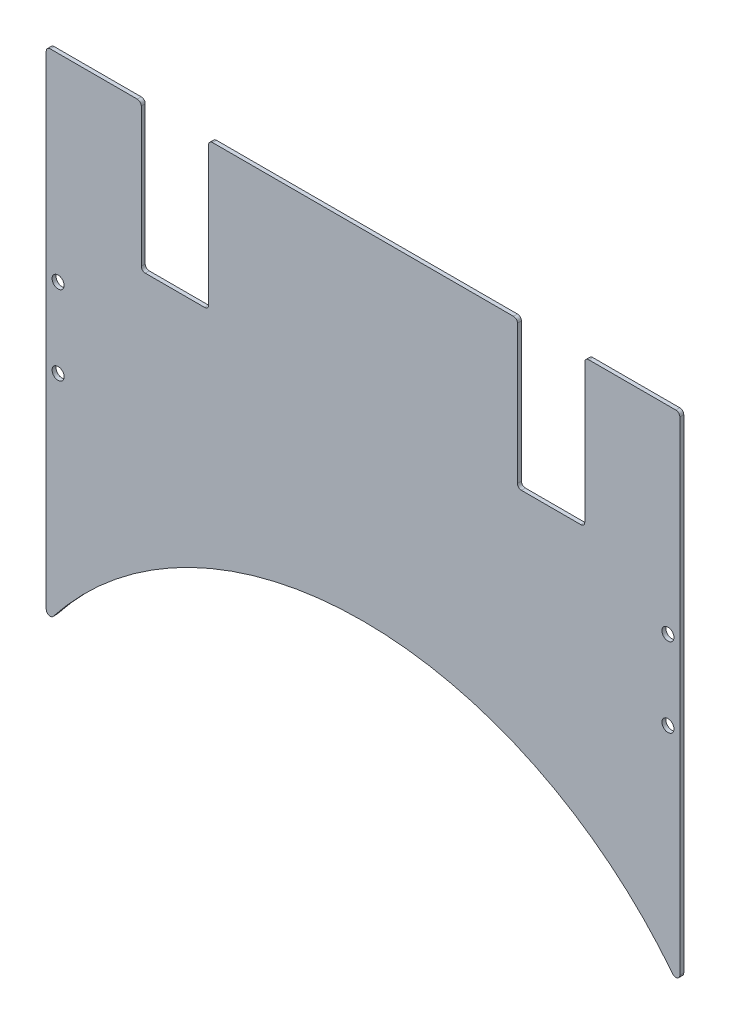
ISO-10303-21;
HEADER;
FILE_DESCRIPTION(('STEP AP214'),'2;1');
FILE_NAME('part.step','',(''),(''),'','','');
FILE_SCHEMA(('AUTOMOTIVE_DESIGN { 1 0 10303 214 1 1 1 1 }'));
ENDSEC;
DATA;
#1=APPLICATION_CONTEXT('core data for automotive mechanical design processes');
#2=APPLICATION_PROTOCOL_DEFINITION('international standard','automotive_design',2000,#1);
#3=PRODUCT_CONTEXT('',#1,'mechanical');
#4=PRODUCT('Part','Part','',(#3));
#5=PRODUCT_RELATED_PRODUCT_CATEGORY('part','',(#4));
#6=PRODUCT_DEFINITION_FORMATION('','',#4);
#7=PRODUCT_DEFINITION_CONTEXT('part definition',#1,'design');
#8=PRODUCT_DEFINITION('design','',#6,#7);
#9=PRODUCT_DEFINITION_SHAPE('','',#8);
#10=(LENGTH_UNIT() NAMED_UNIT(*) SI_UNIT(.MILLI.,.METRE.));
#11=(NAMED_UNIT(*) PLANE_ANGLE_UNIT() SI_UNIT($,.RADIAN.));
#12=(NAMED_UNIT(*) SI_UNIT($,.STERADIAN.) SOLID_ANGLE_UNIT());
#13=UNCERTAINTY_MEASURE_WITH_UNIT(LENGTH_MEASURE(1.E-05),#10,'distance_accuracy_value','');
#14=(GEOMETRIC_REPRESENTATION_CONTEXT(3) GLOBAL_UNCERTAINTY_ASSIGNED_CONTEXT((#13)) GLOBAL_UNIT_ASSIGNED_CONTEXT((#10,
#11,#12)) REPRESENTATION_CONTEXT('',''));
#15=CARTESIAN_POINT('',(0.,0.,0.));
#16=DIRECTION('',(0.,0.,1.));
#17=DIRECTION('',(1.,0.,0.));
#18=AXIS2_PLACEMENT_3D('',#15,#16,#17);
#19=CARTESIAN_POINT('',(-80.,52.,0.5));
#20=DIRECTION('',(0.,-1.,0.));
#21=DIRECTION('',(0.,0.,-1.));
#22=AXIS2_PLACEMENT_3D('',#19,#20,#21);
#23=PLANE('',#22);
#24=DIRECTION('',(-1.,0.,0.));
#25=VECTOR('',#24,1.);
#26=CARTESIAN_POINT('',(-80.,52.,-0.5));
#27=LINE('',#26,#25);
#28=CARTESIAN_POINT('',(-56.9999999999988,52.,-0.5));
#29=VERTEX_POINT('',#28);
#30=CARTESIAN_POINT('',(-79.,52.,-0.5));
#31=VERTEX_POINT('',#30);
#32=EDGE_CURVE('E361',#29,#31,#27,.T.);
#33=ORIENTED_EDGE('',*,*,#32,.T.);
#34=DIRECTION('',(0.,0.,-1.));
#35=VECTOR('',#34,1.);
#36=CARTESIAN_POINT('',(-79.,52.,0.5));
#37=LINE('',#36,#35);
#38=CARTESIAN_POINT('',(-79.,52.,0.5));
#39=VERTEX_POINT('',#38);
#40=EDGE_CURVE('E306',#31,#39,#37,.F.);
#41=ORIENTED_EDGE('',*,*,#40,.T.);
#42=DIRECTION('',(-1.,0.,0.));
#43=VECTOR('',#42,1.);
#44=CARTESIAN_POINT('',(-80.,52.,0.5));
#45=LINE('',#44,#43);
#46=CARTESIAN_POINT('',(-56.9999999999988,52.,0.5));
#47=VERTEX_POINT('',#46);
#48=EDGE_CURVE('E369',#47,#39,#45,.T.);
#49=ORIENTED_EDGE('',*,*,#48,.F.);
#50=DIRECTION('',(0.,0.,1.));
#51=VECTOR('',#50,1.);
#52=CARTESIAN_POINT('',(-56.9999999999988,52.,-0.5));
#53=LINE('',#52,#51);
#54=EDGE_CURVE('E304',#47,#29,#53,.F.);
#55=ORIENTED_EDGE('',*,*,#54,.T.);
#56=EDGE_LOOP('',(#33,#41,#49,#55));
#57=FACE_BOUND('',#56,.T.);
#58=ADVANCED_FACE('F36',(#57),#23,.F.);
#59=CARTESIAN_POINT('',(38.,52.,-0.5));
#60=VERTEX_POINT('',#59);
#61=CARTESIAN_POINT('',(-38.,52.,-0.5));
#62=VERTEX_POINT('',#61);
#63=EDGE_CURVE('E360',#60,#62,#27,.T.);
#64=ORIENTED_EDGE('',*,*,#63,.T.);
#65=DIRECTION('',(0.,0.,-1.));
#66=VECTOR('',#65,1.);
#67=CARTESIAN_POINT('',(-38.,52.,0.5));
#68=LINE('',#67,#66);
#69=CARTESIAN_POINT('',(-38.,52.,0.5));
#70=VERTEX_POINT('',#69);
#71=EDGE_CURVE('E252',#62,#70,#68,.F.);
#72=ORIENTED_EDGE('',*,*,#71,.T.);
#73=CARTESIAN_POINT('',(38.,52.,0.5));
#74=VERTEX_POINT('',#73);
#75=EDGE_CURVE('E368',#74,#70,#45,.T.);
#76=ORIENTED_EDGE('',*,*,#75,.F.);
#77=DIRECTION('',(0.,0.,-1.));
#78=VECTOR('',#77,1.);
#79=CARTESIAN_POINT('',(38.,52.,0.5));
#80=LINE('',#79,#78);
#81=EDGE_CURVE('E249',#74,#60,#80,.T.);
#82=ORIENTED_EDGE('',*,*,#81,.T.);
#83=EDGE_LOOP('',(#64,#72,#76,#82));
#84=FACE_BOUND('',#83,.T.);
#85=ADVANCED_FACE('F432',(#84),#23,.F.);
#86=CARTESIAN_POINT('',(0.,0.,0.5));
#87=DIRECTION('',(0.,0.,-1.));
#88=DIRECTION('',(-1.,0.,0.));
#89=AXIS2_PLACEMENT_3D('',#86,#87,#88);
#90=PLANE('',#89);
#91=CARTESIAN_POINT('',(-77.,1.9999999999957,0.5));
#92=DIRECTION('',(0.,0.,-1.));
#93=DIRECTION('',(-1.,0.,0.));
#94=AXIS2_PLACEMENT_3D('',#91,#92,#93);
#95=CIRCLE('',#94,1.525);
#96=CARTESIAN_POINT('',(-78.525,1.9999999999957,0.5));
#97=VERTEX_POINT('',#96);
#98=EDGE_CURVE('E386',#97,#97,#95,.T.);
#99=ORIENTED_EDGE('',*,*,#98,.T.);
#100=EDGE_LOOP('',(#99));
#101=FACE_BOUND('',#100,.T.);
#102=CARTESIAN_POINT('',(-77.,-18.0000000000043,0.5));
#103=DIRECTION('',(0.,0.,-1.));
#104=DIRECTION('',(-1.,0.,0.));
#105=AXIS2_PLACEMENT_3D('',#102,#103,#104);
#106=CIRCLE('',#105,1.525);
#107=CARTESIAN_POINT('',(-78.525,-18.0000000000043,0.5));
#108=VERTEX_POINT('',#107);
#109=EDGE_CURVE('E393',#108,#108,#106,.T.);
#110=ORIENTED_EDGE('',*,*,#109,.T.);
#111=EDGE_LOOP('',(#110));
#112=FACE_BOUND('',#111,.T.);
#113=CARTESIAN_POINT('',(77.,-18.0000000000043,0.5));
#114=DIRECTION('',(0.,0.,-1.));
#115=DIRECTION('',(-1.,0.,0.));
#116=AXIS2_PLACEMENT_3D('',#113,#114,#115);
#117=CIRCLE('',#116,1.525);
#118=CARTESIAN_POINT('',(75.475,-18.0000000000043,0.5));
#119=VERTEX_POINT('',#118);
#120=EDGE_CURVE('E396',#119,#119,#117,.T.);
#121=ORIENTED_EDGE('',*,*,#120,.T.);
#122=EDGE_LOOP('',(#121));
#123=FACE_BOUND('',#122,.T.);
#124=CARTESIAN_POINT('',(77.,1.9999999999957,0.5));
#125=DIRECTION('',(0.,0.,-1.));
#126=DIRECTION('',(-1.,0.,0.));
#127=AXIS2_PLACEMENT_3D('',#124,#125,#126);
#128=CIRCLE('',#127,1.525);
#129=CARTESIAN_POINT('',(75.475,1.9999999999957,0.5));
#130=VERTEX_POINT('',#129);
#131=EDGE_CURVE('E399',#130,#130,#128,.T.);
#132=ORIENTED_EDGE('',*,*,#131,.T.);
#133=EDGE_LOOP('',(#132));
#134=FACE_BOUND('',#133,.T.);
#135=ORIENTED_EDGE('',*,*,#75,.T.);
#136=CARTESIAN_POINT('',(-38.,51.,0.5));
#137=DIRECTION('',(0.,0.,-1.));
#138=DIRECTION('',(-1.,0.,0.));
#139=AXIS2_PLACEMENT_3D('',#136,#137,#138);
#140=CIRCLE('',#139,1.);
#141=CARTESIAN_POINT('',(-39.,51.,0.5));
#142=VERTEX_POINT('',#141);
#143=EDGE_CURVE('E268',#70,#142,#140,.F.);
#144=ORIENTED_EDGE('',*,*,#143,.T.);
#145=DIRECTION('',(0.,-1.,0.));
#146=VECTOR('',#145,1.);
#147=CARTESIAN_POINT('',(-39.,14.9426406871245,0.5));
#148=LINE('',#147,#146);
#149=CARTESIAN_POINT('',(-39.,15.9426406871245,0.5));
#150=VERTEX_POINT('',#149);
#151=EDGE_CURVE('E380',#142,#150,#148,.T.);
#152=ORIENTED_EDGE('',*,*,#151,.T.);
#153=CARTESIAN_POINT('',(-40.,15.9426406871245,0.5));
#154=DIRECTION('',(0.,0.,-1.));
#155=DIRECTION('',(-1.,0.,0.));
#156=AXIS2_PLACEMENT_3D('',#153,#154,#155);
#157=CIRCLE('',#156,1.);
#158=CARTESIAN_POINT('',(-40.,14.9426406871245,0.5));
#159=VERTEX_POINT('',#158);
#160=EDGE_CURVE('E315',#150,#159,#157,.T.);
#161=ORIENTED_EDGE('',*,*,#160,.T.);
#162=DIRECTION('',(-1.,0.,0.));
#163=VECTOR('',#162,1.);
#164=CARTESIAN_POINT('',(-55.9999999999987,14.9426406871245,0.5));
#165=LINE('',#164,#163);
#166=CARTESIAN_POINT('',(-54.9999999999987,14.9426406871245,0.5));
#167=VERTEX_POINT('',#166);
#168=EDGE_CURVE('E217',#159,#167,#165,.T.);
#169=ORIENTED_EDGE('',*,*,#168,.T.);
#170=CARTESIAN_POINT('',(-54.9999999999987,15.9426406871245,0.5));
#171=DIRECTION('',(0.,0.,-1.));
#172=DIRECTION('',(-1.,0.,0.));
#173=AXIS2_PLACEMENT_3D('',#170,#171,#172);
#174=CIRCLE('',#173,1.);
#175=CARTESIAN_POINT('',(-55.9999999999987,15.9426406871245,0.5));
#176=VERTEX_POINT('',#175);
#177=EDGE_CURVE('E11',#167,#176,#174,.T.);
#178=ORIENTED_EDGE('',*,*,#177,.T.);
#179=DIRECTION('',(0.,1.,0.));
#180=VECTOR('',#179,1.);
#181=CARTESIAN_POINT('',(-55.9999999999987,14.9426406871245,0.5));
#182=LINE('',#181,#180);
#183=CARTESIAN_POINT('',(-55.9999999999987,51.,0.5));
#184=VERTEX_POINT('',#183);
#185=EDGE_CURVE('E383',#176,#184,#182,.T.);
#186=ORIENTED_EDGE('',*,*,#185,.T.);
#187=CARTESIAN_POINT('',(-56.9999999999988,51.,0.5));
#188=DIRECTION('',(0.,0.,-1.));
#189=DIRECTION('',(-1.,0.,0.));
#190=AXIS2_PLACEMENT_3D('',#187,#188,#189);
#191=CIRCLE('',#190,1.);
#192=EDGE_CURVE('E254',#184,#47,#191,.F.);
#193=ORIENTED_EDGE('',*,*,#192,.T.);
#194=ORIENTED_EDGE('',*,*,#48,.T.);
#195=CARTESIAN_POINT('',(-79.,51.,0.5));
#196=DIRECTION('',(0.,0.,-1.));
#197=DIRECTION('',(-1.,0.,0.));
#198=AXIS2_PLACEMENT_3D('',#195,#196,#197);
#199=CIRCLE('',#198,1.);
#200=CARTESIAN_POINT('',(-80.,51.,0.5));
#201=VERTEX_POINT('',#200);
#202=EDGE_CURVE('E256',#39,#201,#199,.F.);
#203=ORIENTED_EDGE('',*,*,#202,.T.);
#204=DIRECTION('',(0.,-1.,0.));
#205=VECTOR('',#204,1.);
#206=CARTESIAN_POINT('',(-80.,-52.,0.5));
#207=LINE('',#206,#205);
#208=CARTESIAN_POINT('',(-80.,-71.0994225690076,0.5));
#209=VERTEX_POINT('',#208);
#210=EDGE_CURVE('E348',#201,#209,#207,.T.);
#211=ORIENTED_EDGE('',*,*,#210,.T.);
#212=CARTESIAN_POINT('',(-79.,-71.0994225690076,0.5));
#213=DIRECTION('',(0.,0.,-1.));
#214=DIRECTION('',(-1.,0.,0.));
#215=AXIS2_PLACEMENT_3D('',#212,#213,#214);
#216=CIRCLE('',#215,1.);
#217=CARTESIAN_POINT('',(-78.2128553631967,-71.716191018875,0.5));
#218=VERTEX_POINT('',#217);
#219=EDGE_CURVE('E258',#209,#218,#216,.F.);
#220=ORIENTED_EDGE('',*,*,#219,.T.);
#221=CARTESIAN_POINT('',(1.3547279617554E-10,-132.999999999715,0.5));
#222=DIRECTION('',(0.,0.,-1.));
#223=DIRECTION('',(-1.,0.,0.));
#224=AXIS2_PLACEMENT_3D('',#221,#222,#223);
#225=CIRCLE('',#224,99.3627494954);
#226=CARTESIAN_POINT('',(78.2128553631994,-71.7161910185327,0.5));
#227=VERTEX_POINT('',#226);
#228=EDGE_CURVE('E364',#227,#218,#225,.F.);
#229=ORIENTED_EDGE('',*,*,#228,.F.);
#230=CARTESIAN_POINT('',(79.,-71.0994225686618,0.5));
#231=DIRECTION('',(0.,0.,-1.));
#232=DIRECTION('',(-1.,0.,0.));
#233=AXIS2_PLACEMENT_3D('',#230,#231,#232);
#234=CIRCLE('',#233,1.);
#235=CARTESIAN_POINT('',(80.,-71.0994225686618,0.5));
#236=VERTEX_POINT('',#235);
#237=EDGE_CURVE('E260',#227,#236,#234,.F.);
#238=ORIENTED_EDGE('',*,*,#237,.T.);
#239=DIRECTION('',(0.,1.,0.));
#240=VECTOR('',#239,1.);
#241=CARTESIAN_POINT('',(80.,-52.,0.5));
#242=LINE('',#241,#240);
#243=CARTESIAN_POINT('',(80.,51.,0.5));
#244=VERTEX_POINT('',#243);
#245=EDGE_CURVE('E356',#236,#244,#242,.T.);
#246=ORIENTED_EDGE('',*,*,#245,.T.);
#247=CARTESIAN_POINT('',(79.,51.,0.5));
#248=DIRECTION('',(0.,0.,-1.));
#249=DIRECTION('',(-1.,0.,0.));
#250=AXIS2_PLACEMENT_3D('',#247,#248,#249);
#251=CIRCLE('',#250,1.);
#252=CARTESIAN_POINT('',(79.,52.,0.5));
#253=VERTEX_POINT('',#252);
#254=EDGE_CURVE('E262',#244,#253,#251,.F.);
#255=ORIENTED_EDGE('',*,*,#254,.T.);
#256=CARTESIAN_POINT('',(56.9999999999988,52.,0.5));
#257=VERTEX_POINT('',#256);
#258=EDGE_CURVE('E350',#253,#257,#45,.T.);
#259=ORIENTED_EDGE('',*,*,#258,.T.);
#260=CARTESIAN_POINT('',(56.9999999999988,51.,0.5));
#261=DIRECTION('',(0.,0.,-1.));
#262=DIRECTION('',(-1.,0.,0.));
#263=AXIS2_PLACEMENT_3D('',#260,#261,#262);
#264=CIRCLE('',#263,1.);
#265=CARTESIAN_POINT('',(55.9999999999987,51.,0.5));
#266=VERTEX_POINT('',#265);
#267=EDGE_CURVE('E264',#257,#266,#264,.F.);
#268=ORIENTED_EDGE('',*,*,#267,.T.);
#269=DIRECTION('',(0.,1.,0.));
#270=VECTOR('',#269,1.);
#271=CARTESIAN_POINT('',(55.9999999999987,14.9426406871245,0.5));
#272=LINE('',#271,#270);
#273=CARTESIAN_POINT('',(55.9999999999987,15.9426406871245,0.5));
#274=VERTEX_POINT('',#273);
#275=EDGE_CURVE('E329',#274,#266,#272,.T.);
#276=ORIENTED_EDGE('',*,*,#275,.F.);
#277=CARTESIAN_POINT('',(54.9999999999987,15.9426406871245,0.5));
#278=DIRECTION('',(0.,0.,-1.));
#279=DIRECTION('',(-1.,0.,0.));
#280=AXIS2_PLACEMENT_3D('',#277,#278,#279);
#281=CIRCLE('',#280,1.);
#282=CARTESIAN_POINT('',(54.9999999999987,14.9426406871245,0.5));
#283=VERTEX_POINT('',#282);
#284=EDGE_CURVE('E208',#274,#283,#281,.T.);
#285=ORIENTED_EDGE('',*,*,#284,.T.);
#286=DIRECTION('',(1.,0.,0.));
#287=VECTOR('',#286,1.);
#288=CARTESIAN_POINT('',(55.9999999999987,14.9426406871245,0.5));
#289=LINE('',#288,#287);
#290=CARTESIAN_POINT('',(40.,14.9426406871245,0.5));
#291=VERTEX_POINT('',#290);
#292=EDGE_CURVE('E327',#291,#283,#289,.T.);
#293=ORIENTED_EDGE('',*,*,#292,.F.);
#294=CARTESIAN_POINT('',(40.,15.9426406871245,0.5));
#295=DIRECTION('',(0.,0.,-1.));
#296=DIRECTION('',(-1.,0.,0.));
#297=AXIS2_PLACEMENT_3D('',#294,#295,#296);
#298=CIRCLE('',#297,1.);
#299=CARTESIAN_POINT('',(39.,15.9426406871245,0.5));
#300=VERTEX_POINT('',#299);
#301=EDGE_CURVE('E51',#291,#300,#298,.T.);
#302=ORIENTED_EDGE('',*,*,#301,.T.);
#303=DIRECTION('',(0.,-1.,0.));
#304=VECTOR('',#303,1.);
#305=CARTESIAN_POINT('',(39.,14.9426406871245,0.5));
#306=LINE('',#305,#304);
#307=CARTESIAN_POINT('',(39.,51.,0.5));
#308=VERTEX_POINT('',#307);
#309=EDGE_CURVE('E338',#308,#300,#306,.T.);
#310=ORIENTED_EDGE('',*,*,#309,.F.);
#311=CARTESIAN_POINT('',(38.,51.,0.5));
#312=DIRECTION('',(0.,0.,-1.));
#313=DIRECTION('',(-1.,0.,0.));
#314=AXIS2_PLACEMENT_3D('',#311,#312,#313);
#315=CIRCLE('',#314,1.);
#316=EDGE_CURVE('E266',#308,#74,#315,.F.);
#317=ORIENTED_EDGE('',*,*,#316,.T.);
#318=EDGE_LOOP('',(#135,#144,#152,#161,#169,#178,#186,#193,#194,#203,#211,#220,#229,#238,#246,
#255,#259,#268,#276,#285,#293,#302,#310,#317));
#319=FACE_BOUND('',#318,.T.);
#320=ADVANCED_FACE('F326',(#101,#112,#123,#134,#319),#90,.F.);
#321=CARTESIAN_POINT('',(0.,0.,-0.5));
#322=DIRECTION('',(0.,0.,-1.));
#323=DIRECTION('',(-1.,0.,0.));
#324=AXIS2_PLACEMENT_3D('',#321,#322,#323);
#325=PLANE('',#324);
#326=CARTESIAN_POINT('',(-77.,1.9999999999957,-0.5));
#327=DIRECTION('',(0.,0.,-1.));
#328=DIRECTION('',(1.,0.,0.));
#329=AXIS2_PLACEMENT_3D('',#326,#327,#328);
#330=CIRCLE('',#329,1.525);
#331=CARTESIAN_POINT('',(-75.475,1.9999999999957,-0.5));
#332=VERTEX_POINT('',#331);
#333=EDGE_CURVE('E406',#332,#332,#330,.T.);
#334=ORIENTED_EDGE('',*,*,#333,.F.);
#335=EDGE_LOOP('',(#334));
#336=FACE_BOUND('',#335,.T.);
#337=CARTESIAN_POINT('',(-77.,-18.0000000000043,-0.5));
#338=DIRECTION('',(0.,0.,-1.));
#339=DIRECTION('',(1.,0.,0.));
#340=AXIS2_PLACEMENT_3D('',#337,#338,#339);
#341=CIRCLE('',#340,1.525);
#342=CARTESIAN_POINT('',(-75.475,-18.0000000000043,-0.5));
#343=VERTEX_POINT('',#342);
#344=EDGE_CURVE('E409',#343,#343,#341,.T.);
#345=ORIENTED_EDGE('',*,*,#344,.F.);
#346=EDGE_LOOP('',(#345));
#347=FACE_BOUND('',#346,.T.);
#348=CARTESIAN_POINT('',(77.,-18.0000000000043,-0.5));
#349=DIRECTION('',(0.,0.,-1.));
#350=DIRECTION('',(-1.,0.,0.));
#351=AXIS2_PLACEMENT_3D('',#348,#349,#350);
#352=CIRCLE('',#351,1.525);
#353=CARTESIAN_POINT('',(75.475,-18.0000000000043,-0.5));
#354=VERTEX_POINT('',#353);
#355=EDGE_CURVE('E405',#354,#354,#352,.T.);
#356=ORIENTED_EDGE('',*,*,#355,.F.);
#357=EDGE_LOOP('',(#356));
#358=FACE_BOUND('',#357,.T.);
#359=CARTESIAN_POINT('',(77.,1.9999999999957,-0.5));
#360=DIRECTION('',(0.,0.,-1.));
#361=DIRECTION('',(-1.,0.,0.));
#362=AXIS2_PLACEMENT_3D('',#359,#360,#361);
#363=CIRCLE('',#362,1.525);
#364=CARTESIAN_POINT('',(75.475,1.9999999999957,-0.5));
#365=VERTEX_POINT('',#364);
#366=EDGE_CURVE('E402',#365,#365,#363,.T.);
#367=ORIENTED_EDGE('',*,*,#366,.F.);
#368=EDGE_LOOP('',(#367));
#369=FACE_BOUND('',#368,.T.);
#370=DIRECTION('',(0.,1.,0.));
#371=VECTOR('',#370,1.);
#372=CARTESIAN_POINT('',(-39.,14.9426406871245,-0.5));
#373=LINE('',#372,#371);
#374=CARTESIAN_POINT('',(-39.,15.9426406871245,-0.5));
#375=VERTEX_POINT('',#374);
#376=CARTESIAN_POINT('',(-39.,51.,-0.5));
#377=VERTEX_POINT('',#376);
#378=EDGE_CURVE('E218',#375,#377,#373,.T.);
#379=ORIENTED_EDGE('',*,*,#378,.T.);
#380=CARTESIAN_POINT('',(-38.,51.,-0.5));
#381=DIRECTION('',(0.,0.,-1.));
#382=DIRECTION('',(-1.,0.,0.));
#383=AXIS2_PLACEMENT_3D('',#380,#381,#382);
#384=CIRCLE('',#383,1.);
#385=EDGE_CURVE('E247',#377,#62,#384,.T.);
#386=ORIENTED_EDGE('',*,*,#385,.T.);
#387=ORIENTED_EDGE('',*,*,#63,.F.);
#388=CARTESIAN_POINT('',(38.,51.,-0.5));
#389=DIRECTION('',(0.,0.,-1.));
#390=DIRECTION('',(-1.,0.,0.));
#391=AXIS2_PLACEMENT_3D('',#388,#389,#390);
#392=CIRCLE('',#391,1.);
#393=CARTESIAN_POINT('',(39.,51.,-0.5));
#394=VERTEX_POINT('',#393);
#395=EDGE_CURVE('E245',#60,#394,#392,.T.);
#396=ORIENTED_EDGE('',*,*,#395,.T.);
#397=DIRECTION('',(0.,1.,0.));
#398=VECTOR('',#397,1.);
#399=CARTESIAN_POINT('',(39.,14.9426406871245,-0.5));
#400=LINE('',#399,#398);
#401=CARTESIAN_POINT('',(39.,15.9426406871245,-0.5));
#402=VERTEX_POINT('',#401);
#403=EDGE_CURVE('E378',#402,#394,#400,.T.);
#404=ORIENTED_EDGE('',*,*,#403,.F.);
#405=CARTESIAN_POINT('',(40.,15.9426406871245,-0.5));
#406=DIRECTION('',(0.,0.,-1.));
#407=DIRECTION('',(-1.,0.,0.));
#408=AXIS2_PLACEMENT_3D('',#405,#406,#407);
#409=CIRCLE('',#408,1.);
#410=CARTESIAN_POINT('',(40.,14.9426406871245,-0.5));
#411=VERTEX_POINT('',#410);
#412=EDGE_CURVE('E317',#402,#411,#409,.F.);
#413=ORIENTED_EDGE('',*,*,#412,.T.);
#414=DIRECTION('',(-1.,0.,0.));
#415=VECTOR('',#414,1.);
#416=CARTESIAN_POINT('',(55.9999999999987,14.9426406871245,-0.5));
#417=LINE('',#416,#415);
#418=CARTESIAN_POINT('',(54.9999999999987,14.9426406871245,-0.5));
#419=VERTEX_POINT('',#418);
#420=EDGE_CURVE('E344',#419,#411,#417,.T.);
#421=ORIENTED_EDGE('',*,*,#420,.F.);
#422=CARTESIAN_POINT('',(54.9999999999987,15.9426406871245,-0.5));
#423=DIRECTION('',(0.,0.,-1.));
#424=DIRECTION('',(-1.,0.,0.));
#425=AXIS2_PLACEMENT_3D('',#422,#423,#424);
#426=CIRCLE('',#425,1.);
#427=CARTESIAN_POINT('',(55.9999999999987,15.9426406871245,-0.5));
#428=VERTEX_POINT('',#427);
#429=EDGE_CURVE('E320',#419,#428,#426,.F.);
#430=ORIENTED_EDGE('',*,*,#429,.T.);
#431=DIRECTION('',(0.,-1.,0.));
#432=VECTOR('',#431,1.);
#433=CARTESIAN_POINT('',(55.9999999999987,0.,-0.5));
#434=LINE('',#433,#432);
#435=CARTESIAN_POINT('',(55.9999999999987,51.,-0.5));
#436=VERTEX_POINT('',#435);
#437=EDGE_CURVE('E225',#436,#428,#434,.T.);
#438=ORIENTED_EDGE('',*,*,#437,.F.);
#439=CARTESIAN_POINT('',(56.9999999999988,51.,-0.5));
#440=DIRECTION('',(0.,0.,-1.));
#441=DIRECTION('',(-1.,0.,0.));
#442=AXIS2_PLACEMENT_3D('',#439,#440,#441);
#443=CIRCLE('',#442,1.);
#444=CARTESIAN_POINT('',(56.9999999999988,52.,-0.5));
#445=VERTEX_POINT('',#444);
#446=EDGE_CURVE('E243',#436,#445,#443,.T.);
#447=ORIENTED_EDGE('',*,*,#446,.T.);
#448=CARTESIAN_POINT('',(79.,52.,-0.5));
#449=VERTEX_POINT('',#448);
#450=EDGE_CURVE('E357',#449,#445,#27,.T.);
#451=ORIENTED_EDGE('',*,*,#450,.F.);
#452=CARTESIAN_POINT('',(79.,51.,-0.5));
#453=DIRECTION('',(0.,0.,-1.));
#454=DIRECTION('',(-1.,0.,0.));
#455=AXIS2_PLACEMENT_3D('',#452,#453,#454);
#456=CIRCLE('',#455,1.);
#457=CARTESIAN_POINT('',(80.,51.,-0.5));
#458=VERTEX_POINT('',#457);
#459=EDGE_CURVE('E241',#449,#458,#456,.T.);
#460=ORIENTED_EDGE('',*,*,#459,.T.);
#461=DIRECTION('',(0.,1.,0.));
#462=VECTOR('',#461,1.);
#463=CARTESIAN_POINT('',(80.,-52.,-0.5));
#464=LINE('',#463,#462);
#465=CARTESIAN_POINT('',(80.,-71.0994225686618,-0.5));
#466=VERTEX_POINT('',#465);
#467=EDGE_CURVE('E362',#466,#458,#464,.T.);
#468=ORIENTED_EDGE('',*,*,#467,.F.);
#469=CARTESIAN_POINT('',(79.,-71.0994225686618,-0.5));
#470=DIRECTION('',(0.,0.,-1.));
#471=DIRECTION('',(-1.,0.,0.));
#472=AXIS2_PLACEMENT_3D('',#469,#470,#471);
#473=CIRCLE('',#472,1.);
#474=CARTESIAN_POINT('',(78.2128553631994,-71.7161910185327,-0.5));
#475=VERTEX_POINT('',#474);
#476=EDGE_CURVE('E239',#466,#475,#473,.T.);
#477=ORIENTED_EDGE('',*,*,#476,.T.);
#478=CARTESIAN_POINT('',(1.3547279617554E-10,-132.999999999715,-0.5));
#479=DIRECTION('',(0.,0.,-1.));
#480=DIRECTION('',(-1.,0.,0.));
#481=AXIS2_PLACEMENT_3D('',#478,#479,#480);
#482=CIRCLE('',#481,99.3627494954);
#483=CARTESIAN_POINT('',(-78.2128553631967,-71.716191018875,-0.5));
#484=VERTEX_POINT('',#483);
#485=EDGE_CURVE('E374',#484,#475,#482,.T.);
#486=ORIENTED_EDGE('',*,*,#485,.F.);
#487=CARTESIAN_POINT('',(-79.,-71.0994225690076,-0.5));
#488=DIRECTION('',(0.,0.,-1.));
#489=DIRECTION('',(-1.,0.,0.));
#490=AXIS2_PLACEMENT_3D('',#487,#488,#489);
#491=CIRCLE('',#490,1.);
#492=CARTESIAN_POINT('',(-80.,-71.0994225690076,-0.5));
#493=VERTEX_POINT('',#492);
#494=EDGE_CURVE('E237',#484,#493,#491,.T.);
#495=ORIENTED_EDGE('',*,*,#494,.T.);
#496=DIRECTION('',(0.,-1.,0.));
#497=VECTOR('',#496,1.);
#498=CARTESIAN_POINT('',(-80.,-52.,-0.5));
#499=LINE('',#498,#497);
#500=CARTESIAN_POINT('',(-80.,51.,-0.5));
#501=VERTEX_POINT('',#500);
#502=EDGE_CURVE('E353',#501,#493,#499,.T.);
#503=ORIENTED_EDGE('',*,*,#502,.F.);
#504=CARTESIAN_POINT('',(-79.,51.,-0.5));
#505=DIRECTION('',(0.,0.,-1.));
#506=DIRECTION('',(-1.,0.,0.));
#507=AXIS2_PLACEMENT_3D('',#504,#505,#506);
#508=CIRCLE('',#507,1.);
#509=EDGE_CURVE('E235',#501,#31,#508,.T.);
#510=ORIENTED_EDGE('',*,*,#509,.T.);
#511=ORIENTED_EDGE('',*,*,#32,.F.);
#512=CARTESIAN_POINT('',(-56.9999999999988,51.,-0.5));
#513=DIRECTION('',(0.,0.,-1.));
#514=DIRECTION('',(-1.,0.,0.));
#515=AXIS2_PLACEMENT_3D('',#512,#513,#514);
#516=CIRCLE('',#515,1.);
#517=CARTESIAN_POINT('',(-55.9999999999987,51.,-0.5));
#518=VERTEX_POINT('',#517);
#519=EDGE_CURVE('E233',#29,#518,#516,.T.);
#520=ORIENTED_EDGE('',*,*,#519,.T.);
#521=DIRECTION('',(0.,-1.,0.));
#522=VECTOR('',#521,1.);
#523=CARTESIAN_POINT('',(-55.9999999999987,0.,-0.5));
#524=LINE('',#523,#522);
#525=CARTESIAN_POINT('',(-55.9999999999987,15.9426406871245,-0.5));
#526=VERTEX_POINT('',#525);
#527=EDGE_CURVE('E203',#518,#526,#524,.T.);
#528=ORIENTED_EDGE('',*,*,#527,.T.);
#529=CARTESIAN_POINT('',(-54.9999999999987,15.9426406871245,-0.5));
#530=DIRECTION('',(0.,0.,-1.));
#531=DIRECTION('',(-1.,0.,0.));
#532=AXIS2_PLACEMENT_3D('',#529,#530,#531);
#533=CIRCLE('',#532,1.);
#534=CARTESIAN_POINT('',(-54.9999999999987,14.9426406871245,-0.5));
#535=VERTEX_POINT('',#534);
#536=EDGE_CURVE('E44',#526,#535,#533,.F.);
#537=ORIENTED_EDGE('',*,*,#536,.T.);
#538=DIRECTION('',(1.,0.,0.));
#539=VECTOR('',#538,1.);
#540=CARTESIAN_POINT('',(-55.9999999999987,14.9426406871245,-0.5));
#541=LINE('',#540,#539);
#542=CARTESIAN_POINT('',(-40.,14.9426406871245,-0.5));
#543=VERTEX_POINT('',#542);
#544=EDGE_CURVE('E201',#535,#543,#541,.T.);
#545=ORIENTED_EDGE('',*,*,#544,.T.);
#546=CARTESIAN_POINT('',(-40.,15.9426406871245,-0.5));
#547=DIRECTION('',(0.,0.,-1.));
#548=DIRECTION('',(-1.,0.,0.));
#549=AXIS2_PLACEMENT_3D('',#546,#547,#548);
#550=CIRCLE('',#549,1.);
#551=EDGE_CURVE('E313',#543,#375,#550,.F.);
#552=ORIENTED_EDGE('',*,*,#551,.T.);
#553=EDGE_LOOP('',(#379,#386,#387,#396,#404,#413,#421,#430,#438,#447,#451,#460,#468,#477,#486,
#495,#503,#510,#511,#520,#528,#537,#545,#552));
#554=FACE_BOUND('',#553,.T.);
#555=ADVANCED_FACE('F200',(#336,#347,#358,#369,#554),#325,.T.);
#556=CARTESIAN_POINT('',(80.,-52.,0.5));
#557=DIRECTION('',(-1.,0.,0.));
#558=DIRECTION('',(0.,0.,1.));
#559=AXIS2_PLACEMENT_3D('',#556,#557,#558);
#560=PLANE('',#559);
#561=ORIENTED_EDGE('',*,*,#467,.T.);
#562=DIRECTION('',(0.,0.,-1.));
#563=VECTOR('',#562,1.);
#564=CARTESIAN_POINT('',(80.,51.,0.5));
#565=LINE('',#564,#563);
#566=EDGE_CURVE('E292',#458,#244,#565,.F.);
#567=ORIENTED_EDGE('',*,*,#566,.T.);
#568=ORIENTED_EDGE('',*,*,#245,.F.);
#569=DIRECTION('',(0.,0.,-1.));
#570=VECTOR('',#569,1.);
#571=CARTESIAN_POINT('',(80.,-71.0994225686618,0.5));
#572=LINE('',#571,#570);
#573=EDGE_CURVE('E289',#236,#466,#572,.T.);
#574=ORIENTED_EDGE('',*,*,#573,.T.);
#575=EDGE_LOOP('',(#561,#567,#568,#574));
#576=FACE_BOUND('',#575,.T.);
#577=ADVANCED_FACE('F420',(#576),#560,.F.);
#578=ORIENTED_EDGE('',*,*,#450,.T.);
#579=DIRECTION('',(0.,0.,1.));
#580=VECTOR('',#579,1.);
#581=CARTESIAN_POINT('',(56.9999999999988,52.,0.5));
#582=LINE('',#581,#580);
#583=EDGE_CURVE('E286',#445,#257,#582,.T.);
#584=ORIENTED_EDGE('',*,*,#583,.T.);
#585=ORIENTED_EDGE('',*,*,#258,.F.);
#586=DIRECTION('',(0.,0.,-1.));
#587=VECTOR('',#586,1.);
#588=CARTESIAN_POINT('',(79.,52.,0.5));
#589=LINE('',#588,#587);
#590=EDGE_CURVE('E283',#253,#449,#589,.T.);
#591=ORIENTED_EDGE('',*,*,#590,.T.);
#592=EDGE_LOOP('',(#578,#584,#585,#591));
#593=FACE_BOUND('',#592,.T.);
#594=ADVANCED_FACE('F440',(#593),#23,.F.);
#595=CARTESIAN_POINT('',(-80.,-52.,0.5));
#596=DIRECTION('',(1.,0.,0.));
#597=DIRECTION('',(0.,0.,-1.));
#598=AXIS2_PLACEMENT_3D('',#595,#596,#597);
#599=PLANE('',#598);
#600=ORIENTED_EDGE('',*,*,#502,.T.);
#601=DIRECTION('',(0.,0.,-1.));
#602=VECTOR('',#601,1.);
#603=CARTESIAN_POINT('',(-80.,-71.0994225690076,0.5));
#604=LINE('',#603,#602);
#605=EDGE_CURVE('E302',#493,#209,#604,.F.);
#606=ORIENTED_EDGE('',*,*,#605,.T.);
#607=ORIENTED_EDGE('',*,*,#210,.F.);
#608=DIRECTION('',(0.,0.,-1.));
#609=VECTOR('',#608,1.);
#610=CARTESIAN_POINT('',(-80.,51.,0.5));
#611=LINE('',#610,#609);
#612=EDGE_CURVE('E299',#201,#501,#611,.T.);
#613=ORIENTED_EDGE('',*,*,#612,.T.);
#614=EDGE_LOOP('',(#600,#606,#607,#613));
#615=FACE_BOUND('',#614,.T.);
#616=ADVANCED_FACE('F451',(#615),#599,.F.);
#617=CARTESIAN_POINT('',(1.3547279617554E-10,-132.999999999715,281.54029586215));
#618=DIRECTION('',(0.,0.,-1.));
#619=DIRECTION('',(-1.,0.,0.));
#620=AXIS2_PLACEMENT_3D('',#617,#618,#619);
#621=CYLINDRICAL_SURFACE('',#620,99.3627494954);
#622=ORIENTED_EDGE('',*,*,#485,.T.);
#623=DIRECTION('',(0.,0.,-1.));
#624=VECTOR('',#623,1.);
#625=CARTESIAN_POINT('',(78.2128553631994,-71.7161910185327,281.54029586215));
#626=LINE('',#625,#624);
#627=EDGE_CURVE('E297',#475,#227,#626,.F.);
#628=ORIENTED_EDGE('',*,*,#627,.T.);
#629=ORIENTED_EDGE('',*,*,#228,.T.);
#630=DIRECTION('',(0.,0.,-1.));
#631=VECTOR('',#630,1.);
#632=CARTESIAN_POINT('',(-78.2128553631967,-71.716191018875,281.54029586215));
#633=LINE('',#632,#631);
#634=EDGE_CURVE('E294',#218,#484,#633,.T.);
#635=ORIENTED_EDGE('',*,*,#634,.T.);
#636=EDGE_LOOP('',(#622,#628,#629,#635));
#637=FACE_BOUND('',#636,.T.);
#638=ADVANCED_FACE('F457',(#637),#621,.F.);
#639=CARTESIAN_POINT('',(39.,14.9426406871245,94.3366215961492));
#640=DIRECTION('',(-1.,0.,0.));
#641=DIRECTION('',(0.,0.,1.));
#642=AXIS2_PLACEMENT_3D('',#639,#640,#641);
#643=PLANE('',#642);
#644=ORIENTED_EDGE('',*,*,#403,.T.);
#645=DIRECTION('',(0.,0.,-1.));
#646=VECTOR('',#645,1.);
#647=CARTESIAN_POINT('',(39.,51.,94.3366215961492));
#648=LINE('',#647,#646);
#649=EDGE_CURVE('E58',#394,#308,#648,.F.);
#650=ORIENTED_EDGE('',*,*,#649,.T.);
#651=ORIENTED_EDGE('',*,*,#309,.T.);
#652=DIRECTION('',(0.,0.,-1.));
#653=VECTOR('',#652,1.);
#654=CARTESIAN_POINT('',(39.,15.9426406871245,-0.5));
#655=LINE('',#654,#653);
#656=EDGE_CURVE('E270',#300,#402,#655,.T.);
#657=ORIENTED_EDGE('',*,*,#656,.T.);
#658=EDGE_LOOP('',(#644,#650,#651,#657));
#659=FACE_BOUND('',#658,.T.);
#660=ADVANCED_FACE('F574',(#659),#643,.F.);
#661=CARTESIAN_POINT('',(55.9999999999987,14.9426406871245,94.3366215961492));
#662=DIRECTION('',(1.,0.,0.));
#663=DIRECTION('',(0.,0.,-1.));
#664=AXIS2_PLACEMENT_3D('',#661,#662,#663);
#665=PLANE('',#664);
#666=ORIENTED_EDGE('',*,*,#437,.T.);
#667=DIRECTION('',(0.,0.,-1.));
#668=VECTOR('',#667,1.);
#669=CARTESIAN_POINT('',(55.9999999999987,15.9426406871245,0.5));
#670=LINE('',#669,#668);
#671=EDGE_CURVE('E281',#428,#274,#670,.F.);
#672=ORIENTED_EDGE('',*,*,#671,.T.);
#673=ORIENTED_EDGE('',*,*,#275,.T.);
#674=DIRECTION('',(0.,0.,1.));
#675=VECTOR('',#674,1.);
#676=CARTESIAN_POINT('',(55.9999999999987,51.,94.3366215961492));
#677=LINE('',#676,#675);
#678=EDGE_CURVE('E279',#266,#436,#677,.F.);
#679=ORIENTED_EDGE('',*,*,#678,.T.);
#680=EDGE_LOOP('',(#666,#672,#673,#679));
#681=FACE_BOUND('',#680,.T.);
#682=ADVANCED_FACE('F346',(#681),#665,.F.);
#683=CARTESIAN_POINT('',(55.9999999999987,14.9426406871245,94.3366215961492));
#684=DIRECTION('',(0.,-1.,0.));
#685=DIRECTION('',(0.,0.,-1.));
#686=AXIS2_PLACEMENT_3D('',#683,#684,#685);
#687=PLANE('',#686);
#688=ORIENTED_EDGE('',*,*,#420,.T.);
#689=DIRECTION('',(0.,0.,-1.));
#690=VECTOR('',#689,1.);
#691=CARTESIAN_POINT('',(40.,14.9426406871245,0.5));
#692=LINE('',#691,#690);
#693=EDGE_CURVE('E277',#411,#291,#692,.F.);
#694=ORIENTED_EDGE('',*,*,#693,.T.);
#695=ORIENTED_EDGE('',*,*,#292,.T.);
#696=DIRECTION('',(0.,0.,-1.));
#697=VECTOR('',#696,1.);
#698=CARTESIAN_POINT('',(54.9999999999987,14.9426406871245,-0.5));
#699=LINE('',#698,#697);
#700=EDGE_CURVE('E274',#283,#419,#699,.T.);
#701=ORIENTED_EDGE('',*,*,#700,.T.);
#702=EDGE_LOOP('',(#688,#694,#695,#701));
#703=FACE_BOUND('',#702,.T.);
#704=ADVANCED_FACE('F335',(#703),#687,.F.);
#705=CARTESIAN_POINT('',(-55.9999999999987,14.9426406871245,94.3366215961492));
#706=DIRECTION('',(1.,0.,0.));
#707=DIRECTION('',(0.,0.,-1.));
#708=AXIS2_PLACEMENT_3D('',#705,#706,#707);
#709=PLANE('',#708);
#710=ORIENTED_EDGE('',*,*,#185,.F.);
#711=DIRECTION('',(0.,0.,-1.));
#712=VECTOR('',#711,1.);
#713=CARTESIAN_POINT('',(-55.9999999999987,15.9426406871245,-0.5));
#714=LINE('',#713,#712);
#715=EDGE_CURVE('E311',#176,#526,#714,.T.);
#716=ORIENTED_EDGE('',*,*,#715,.T.);
#717=ORIENTED_EDGE('',*,*,#527,.F.);
#718=DIRECTION('',(0.,0.,1.));
#719=VECTOR('',#718,1.);
#720=CARTESIAN_POINT('',(-55.9999999999987,51.,0.5));
#721=LINE('',#720,#719);
#722=EDGE_CURVE('E308',#518,#184,#721,.T.);
#723=ORIENTED_EDGE('',*,*,#722,.T.);
#724=EDGE_LOOP('',(#710,#716,#717,#723));
#725=FACE_BOUND('',#724,.T.);
#726=ADVANCED_FACE('F516',(#725),#709,.T.);
#727=CARTESIAN_POINT('',(-39.,14.9426406871245,94.3366215961492));
#728=DIRECTION('',(-1.,0.,0.));
#729=DIRECTION('',(0.,0.,1.));
#730=AXIS2_PLACEMENT_3D('',#727,#728,#729);
#731=PLANE('',#730);
#732=ORIENTED_EDGE('',*,*,#378,.F.);
#733=DIRECTION('',(0.,0.,-1.));
#734=VECTOR('',#733,1.);
#735=CARTESIAN_POINT('',(-39.,15.9426406871245,0.5));
#736=LINE('',#735,#734);
#737=EDGE_CURVE('E231',#375,#150,#736,.F.);
#738=ORIENTED_EDGE('',*,*,#737,.T.);
#739=ORIENTED_EDGE('',*,*,#151,.F.);
#740=DIRECTION('',(0.,0.,-1.));
#741=VECTOR('',#740,1.);
#742=CARTESIAN_POINT('',(-39.,51.,-0.5));
#743=LINE('',#742,#741);
#744=EDGE_CURVE('E223',#142,#377,#743,.T.);
#745=ORIENTED_EDGE('',*,*,#744,.T.);
#746=EDGE_LOOP('',(#732,#738,#739,#745));
#747=FACE_BOUND('',#746,.T.);
#748=ADVANCED_FACE('F510',(#747),#731,.T.);
#749=CARTESIAN_POINT('',(-55.9999999999987,14.9426406871245,94.3366215961492));
#750=DIRECTION('',(0.,1.,0.));
#751=DIRECTION('',(0.,0.,1.));
#752=AXIS2_PLACEMENT_3D('',#749,#750,#751);
#753=PLANE('',#752);
#754=ORIENTED_EDGE('',*,*,#168,.F.);
#755=DIRECTION('',(0.,0.,-1.));
#756=VECTOR('',#755,1.);
#757=CARTESIAN_POINT('',(-40.,14.9426406871245,-0.5));
#758=LINE('',#757,#756);
#759=EDGE_CURVE('E216',#159,#543,#758,.T.);
#760=ORIENTED_EDGE('',*,*,#759,.T.);
#761=ORIENTED_EDGE('',*,*,#544,.F.);
#762=DIRECTION('',(0.,0.,-1.));
#763=VECTOR('',#762,1.);
#764=CARTESIAN_POINT('',(-54.9999999999987,14.9426406871245,0.5));
#765=LINE('',#764,#763);
#766=EDGE_CURVE('E213',#535,#167,#765,.F.);
#767=ORIENTED_EDGE('',*,*,#766,.T.);
#768=EDGE_LOOP('',(#754,#760,#761,#767));
#769=FACE_BOUND('',#768,.T.);
#770=ADVANCED_FACE('F212',(#769),#753,.T.);
#771=CARTESIAN_POINT('',(77.,1.9999999999957,9.5));
#772=DIRECTION('',(0.,0.,-1.));
#773=DIRECTION('',(-1.,0.,0.));
#774=AXIS2_PLACEMENT_3D('',#771,#772,#773);
#775=CYLINDRICAL_SURFACE('',#774,1.525);
#776=ORIENTED_EDGE('',*,*,#366,.T.);
#777=EDGE_LOOP('',(#776));
#778=FACE_BOUND('',#777,.T.);
#779=ORIENTED_EDGE('',*,*,#131,.F.);
#780=EDGE_LOOP('',(#779));
#781=FACE_BOUND('',#780,.T.);
#782=ADVANCED_FACE('F425',(#778,#781),#775,.F.);
#783=CARTESIAN_POINT('',(77.,-18.0000000000043,9.5));
#784=DIRECTION('',(0.,0.,-1.));
#785=DIRECTION('',(-1.,0.,0.));
#786=AXIS2_PLACEMENT_3D('',#783,#784,#785);
#787=CYLINDRICAL_SURFACE('',#786,1.525);
#788=ORIENTED_EDGE('',*,*,#355,.T.);
#789=EDGE_LOOP('',(#788));
#790=FACE_BOUND('',#789,.T.);
#791=ORIENTED_EDGE('',*,*,#120,.F.);
#792=EDGE_LOOP('',(#791));
#793=FACE_BOUND('',#792,.T.);
#794=ADVANCED_FACE('F415',(#790,#793),#787,.F.);
#795=CARTESIAN_POINT('',(-77.,-18.0000000000043,9.5));
#796=DIRECTION('',(0.,0.,-1.));
#797=DIRECTION('',(-1.,0.,0.));
#798=AXIS2_PLACEMENT_3D('',#795,#796,#797);
#799=CYLINDRICAL_SURFACE('',#798,1.525);
#800=ORIENTED_EDGE('',*,*,#344,.T.);
#801=EDGE_LOOP('',(#800));
#802=FACE_BOUND('',#801,.T.);
#803=ORIENTED_EDGE('',*,*,#109,.F.);
#804=EDGE_LOOP('',(#803));
#805=FACE_BOUND('',#804,.T.);
#806=ADVANCED_FACE('F553',(#802,#805),#799,.F.);
#807=CARTESIAN_POINT('',(-77.,1.9999999999957,9.5));
#808=DIRECTION('',(0.,0.,-1.));
#809=DIRECTION('',(-1.,0.,0.));
#810=AXIS2_PLACEMENT_3D('',#807,#808,#809);
#811=CYLINDRICAL_SURFACE('',#810,1.525);
#812=ORIENTED_EDGE('',*,*,#333,.T.);
#813=EDGE_LOOP('',(#812));
#814=FACE_BOUND('',#813,.T.);
#815=ORIENTED_EDGE('',*,*,#98,.F.);
#816=EDGE_LOOP('',(#815));
#817=FACE_BOUND('',#816,.T.);
#818=ADVANCED_FACE('F549',(#814,#817),#811,.F.);
#819=CARTESIAN_POINT('',(-40.,15.9426406871245,94.3366215961492));
#820=DIRECTION('',(0.,0.,1.));
#821=DIRECTION('',(1.,0.,0.));
#822=AXIS2_PLACEMENT_3D('',#819,#820,#821);
#823=CYLINDRICAL_SURFACE('',#822,1.);
#824=ORIENTED_EDGE('',*,*,#160,.F.);
#825=ORIENTED_EDGE('',*,*,#737,.F.);
#826=ORIENTED_EDGE('',*,*,#551,.F.);
#827=ORIENTED_EDGE('',*,*,#759,.F.);
#828=EDGE_LOOP('',(#824,#825,#826,#827));
#829=FACE_BOUND('',#828,.T.);
#830=ADVANCED_FACE('F513',(#829),#823,.F.);
#831=CARTESIAN_POINT('',(-38.,51.,94.3366215961492));
#832=DIRECTION('',(0.,0.,1.));
#833=DIRECTION('',(1.,0.,0.));
#834=AXIS2_PLACEMENT_3D('',#831,#832,#833);
#835=CYLINDRICAL_SURFACE('',#834,1.);
#836=ORIENTED_EDGE('',*,*,#143,.F.);
#837=ORIENTED_EDGE('',*,*,#71,.F.);
#838=ORIENTED_EDGE('',*,*,#385,.F.);
#839=ORIENTED_EDGE('',*,*,#744,.F.);
#840=EDGE_LOOP('',(#836,#837,#838,#839));
#841=FACE_BOUND('',#840,.T.);
#842=ADVANCED_FACE('F504',(#841),#835,.T.);
#843=CARTESIAN_POINT('',(38.,51.,0.5));
#844=DIRECTION('',(0.,0.,-1.));
#845=DIRECTION('',(-1.,0.,0.));
#846=AXIS2_PLACEMENT_3D('',#843,#844,#845);
#847=CYLINDRICAL_SURFACE('',#846,1.);
#848=ORIENTED_EDGE('',*,*,#316,.F.);
#849=ORIENTED_EDGE('',*,*,#649,.F.);
#850=ORIENTED_EDGE('',*,*,#395,.F.);
#851=ORIENTED_EDGE('',*,*,#81,.F.);
#852=EDGE_LOOP('',(#848,#849,#850,#851));
#853=FACE_BOUND('',#852,.T.);
#854=ADVANCED_FACE('F541',(#853),#847,.T.);
#855=CARTESIAN_POINT('',(40.,15.9426406871245,94.3366215961492));
#856=DIRECTION('',(0.,0.,1.));
#857=DIRECTION('',(1.,0.,0.));
#858=AXIS2_PLACEMENT_3D('',#855,#856,#857);
#859=CYLINDRICAL_SURFACE('',#858,1.);
#860=ORIENTED_EDGE('',*,*,#301,.F.);
#861=ORIENTED_EDGE('',*,*,#693,.F.);
#862=ORIENTED_EDGE('',*,*,#412,.F.);
#863=ORIENTED_EDGE('',*,*,#656,.F.);
#864=EDGE_LOOP('',(#860,#861,#862,#863));
#865=FACE_BOUND('',#864,.T.);
#866=ADVANCED_FACE('F538',(#865),#859,.F.);
#867=CARTESIAN_POINT('',(54.9999999999987,15.9426406871245,94.3366215961492));
#868=DIRECTION('',(0.,0.,1.));
#869=DIRECTION('',(1.,0.,0.));
#870=AXIS2_PLACEMENT_3D('',#867,#868,#869);
#871=CYLINDRICAL_SURFACE('',#870,1.);
#872=ORIENTED_EDGE('',*,*,#284,.F.);
#873=ORIENTED_EDGE('',*,*,#671,.F.);
#874=ORIENTED_EDGE('',*,*,#429,.F.);
#875=ORIENTED_EDGE('',*,*,#700,.F.);
#876=EDGE_LOOP('',(#872,#873,#874,#875));
#877=FACE_BOUND('',#876,.T.);
#878=ADVANCED_FACE('F340',(#877),#871,.F.);
#879=CARTESIAN_POINT('',(56.9999999999988,51.,0.5));
#880=DIRECTION('',(0.,0.,1.));
#881=DIRECTION('',(1.,0.,0.));
#882=AXIS2_PLACEMENT_3D('',#879,#880,#881);
#883=CYLINDRICAL_SURFACE('',#882,1.);
#884=ORIENTED_EDGE('',*,*,#446,.F.);
#885=ORIENTED_EDGE('',*,*,#678,.F.);
#886=ORIENTED_EDGE('',*,*,#267,.F.);
#887=ORIENTED_EDGE('',*,*,#583,.F.);
#888=EDGE_LOOP('',(#884,#885,#886,#887));
#889=FACE_BOUND('',#888,.T.);
#890=ADVANCED_FACE('F465',(#889),#883,.T.);
#891=CARTESIAN_POINT('',(79.,51.,0.5));
#892=DIRECTION('',(0.,0.,-1.));
#893=DIRECTION('',(-1.,0.,0.));
#894=AXIS2_PLACEMENT_3D('',#891,#892,#893);
#895=CYLINDRICAL_SURFACE('',#894,1.);
#896=ORIENTED_EDGE('',*,*,#254,.F.);
#897=ORIENTED_EDGE('',*,*,#566,.F.);
#898=ORIENTED_EDGE('',*,*,#459,.F.);
#899=ORIENTED_EDGE('',*,*,#590,.F.);
#900=EDGE_LOOP('',(#896,#897,#898,#899));
#901=FACE_BOUND('',#900,.T.);
#902=ADVANCED_FACE('F468',(#901),#895,.T.);
#903=CARTESIAN_POINT('',(79.,-71.0994225686618,281.54029586215));
#904=DIRECTION('',(0.,0.,-1.));
#905=DIRECTION('',(-1.,0.,0.));
#906=AXIS2_PLACEMENT_3D('',#903,#904,#905);
#907=CYLINDRICAL_SURFACE('',#906,1.);
#908=ORIENTED_EDGE('',*,*,#237,.F.);
#909=ORIENTED_EDGE('',*,*,#627,.F.);
#910=ORIENTED_EDGE('',*,*,#476,.F.);
#911=ORIENTED_EDGE('',*,*,#573,.F.);
#912=EDGE_LOOP('',(#908,#909,#910,#911));
#913=FACE_BOUND('',#912,.T.);
#914=ADVANCED_FACE('F475',(#913),#907,.T.);
#915=CARTESIAN_POINT('',(-79.,-71.0994225690076,281.54029586215));
#916=DIRECTION('',(0.,0.,-1.));
#917=DIRECTION('',(-1.,0.,0.));
#918=AXIS2_PLACEMENT_3D('',#915,#916,#917);
#919=CYLINDRICAL_SURFACE('',#918,1.);
#920=ORIENTED_EDGE('',*,*,#219,.F.);
#921=ORIENTED_EDGE('',*,*,#605,.F.);
#922=ORIENTED_EDGE('',*,*,#494,.F.);
#923=ORIENTED_EDGE('',*,*,#634,.F.);
#924=EDGE_LOOP('',(#920,#921,#922,#923));
#925=FACE_BOUND('',#924,.T.);
#926=ADVANCED_FACE('F483',(#925),#919,.T.);
#927=CARTESIAN_POINT('',(-79.,51.,0.5));
#928=DIRECTION('',(0.,0.,-1.));
#929=DIRECTION('',(-1.,0.,0.));
#930=AXIS2_PLACEMENT_3D('',#927,#928,#929);
#931=CYLINDRICAL_SURFACE('',#930,1.);
#932=ORIENTED_EDGE('',*,*,#202,.F.);
#933=ORIENTED_EDGE('',*,*,#40,.F.);
#934=ORIENTED_EDGE('',*,*,#509,.F.);
#935=ORIENTED_EDGE('',*,*,#612,.F.);
#936=EDGE_LOOP('',(#932,#933,#934,#935));
#937=FACE_BOUND('',#936,.T.);
#938=ADVANCED_FACE('F490',(#937),#931,.T.);
#939=CARTESIAN_POINT('',(-54.9999999999987,15.9426406871245,94.3366215961492));
#940=DIRECTION('',(0.,0.,1.));
#941=DIRECTION('',(1.,0.,0.));
#942=AXIS2_PLACEMENT_3D('',#939,#940,#941);
#943=CYLINDRICAL_SURFACE('',#942,1.);
#944=ORIENTED_EDGE('',*,*,#177,.F.);
#945=ORIENTED_EDGE('',*,*,#766,.F.);
#946=ORIENTED_EDGE('',*,*,#536,.F.);
#947=ORIENTED_EDGE('',*,*,#715,.F.);
#948=EDGE_LOOP('',(#944,#945,#946,#947));
#949=FACE_BOUND('',#948,.T.);
#950=ADVANCED_FACE('F221',(#949),#943,.F.);
#951=CARTESIAN_POINT('',(-56.9999999999988,51.,94.3366215961492));
#952=DIRECTION('',(0.,0.,-1.));
#953=DIRECTION('',(-1.,0.,0.));
#954=AXIS2_PLACEMENT_3D('',#951,#952,#953);
#955=CYLINDRICAL_SURFACE('',#954,1.);
#956=ORIENTED_EDGE('',*,*,#519,.F.);
#957=ORIENTED_EDGE('',*,*,#54,.F.);
#958=ORIENTED_EDGE('',*,*,#192,.F.);
#959=ORIENTED_EDGE('',*,*,#722,.F.);
#960=EDGE_LOOP('',(#956,#957,#958,#959));
#961=FACE_BOUND('',#960,.T.);
#962=ADVANCED_FACE('F38',(#961),#955,.T.);
#963=CLOSED_SHELL('',(#58,#85,#320,#555,#577,#594,#616,#638,#660,#682,#704,#726,#748,#770,#782,
#794,#806,#818,#830,#842,#854,#866,#878,#890,#902,#914,#926,#938,#950,#962));
#964=MANIFOLD_SOLID_BREP('B2',#963);
#965=ADVANCED_BREP_SHAPE_REPRESENTATION('',(#18,#964),#14);
#966=SHAPE_DEFINITION_REPRESENTATION(#9,#965);
ENDSEC;
END-ISO-10303-21;
